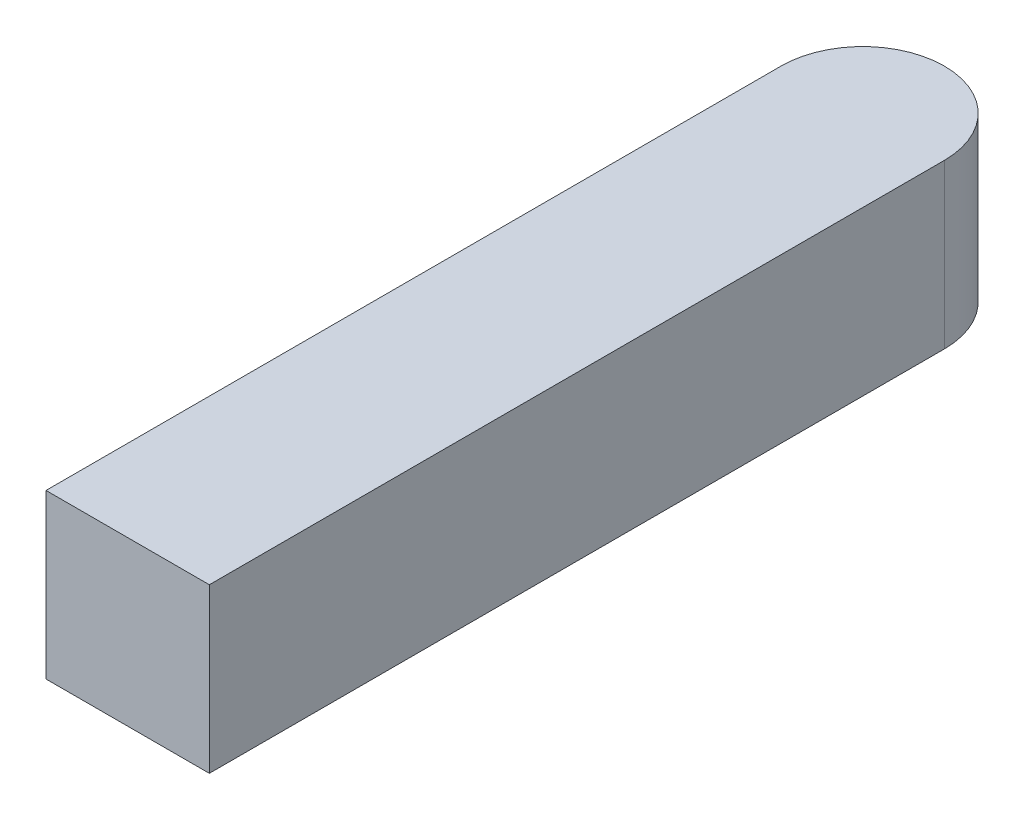
ISO-10303-21;
HEADER;
FILE_DESCRIPTION(('STEP AP214'),'2;1');
FILE_NAME('part.step','',(''),(''),'','','');
FILE_SCHEMA(('AUTOMOTIVE_DESIGN { 1 0 10303 214 1 1 1 1 }'));
ENDSEC;
DATA;
#1=APPLICATION_CONTEXT('core data for automotive mechanical design processes');
#2=APPLICATION_PROTOCOL_DEFINITION('international standard','automotive_design',2000,#1);
#3=PRODUCT_CONTEXT('',#1,'mechanical');
#4=PRODUCT('Part','Part','',(#3));
#5=PRODUCT_RELATED_PRODUCT_CATEGORY('part','',(#4));
#6=PRODUCT_DEFINITION_FORMATION('','',#4);
#7=PRODUCT_DEFINITION_CONTEXT('part definition',#1,'design');
#8=PRODUCT_DEFINITION('design','',#6,#7);
#9=PRODUCT_DEFINITION_SHAPE('','',#8);
#10=(LENGTH_UNIT() NAMED_UNIT(*) SI_UNIT(.MILLI.,.METRE.));
#11=(NAMED_UNIT(*) PLANE_ANGLE_UNIT() SI_UNIT($,.RADIAN.));
#12=(NAMED_UNIT(*) SI_UNIT($,.STERADIAN.) SOLID_ANGLE_UNIT());
#13=UNCERTAINTY_MEASURE_WITH_UNIT(LENGTH_MEASURE(1.E-05),#10,'distance_accuracy_value','');
#14=(GEOMETRIC_REPRESENTATION_CONTEXT(3) GLOBAL_UNCERTAINTY_ASSIGNED_CONTEXT((#13)) GLOBAL_UNIT_ASSIGNED_CONTEXT((#10,
#11,#12)) REPRESENTATION_CONTEXT('',''));
#15=CARTESIAN_POINT('',(0.,0.,0.));
#16=DIRECTION('',(0.,0.,1.));
#17=DIRECTION('',(1.,0.,0.));
#18=AXIS2_PLACEMENT_3D('',#15,#16,#17);
#19=CARTESIAN_POINT('',(1.5,1.5,-6.75));
#20=DIRECTION('',(-1.,0.,0.));
#21=DIRECTION('',(0.,0.,1.));
#22=AXIS2_PLACEMENT_3D('',#19,#20,#21);
#23=PLANE('',#22);
#24=DIRECTION('',(0.,0.,-1.));
#25=VECTOR('',#24,1.);
#26=CARTESIAN_POINT('',(1.5,-1.5,-6.75));
#27=LINE('',#26,#25);
#28=CARTESIAN_POINT('',(1.5,-1.5,6.75));
#29=VERTEX_POINT('',#28);
#30=CARTESIAN_POINT('',(1.5,-1.5,-6.75));
#31=VERTEX_POINT('',#30);
#32=EDGE_CURVE('E96',#29,#31,#27,.T.);
#33=ORIENTED_EDGE('',*,*,#32,.T.);
#34=DIRECTION('',(0.,-1.,0.));
#35=VECTOR('',#34,1.);
#36=CARTESIAN_POINT('',(1.5,1.5,-6.75));
#37=LINE('',#36,#35);
#38=CARTESIAN_POINT('',(1.5,1.5,-6.75));
#39=VERTEX_POINT('',#38);
#40=EDGE_CURVE('E11',#39,#31,#37,.T.);
#41=ORIENTED_EDGE('',*,*,#40,.F.);
#42=DIRECTION('',(0.,0.,-1.));
#43=VECTOR('',#42,1.);
#44=CARTESIAN_POINT('',(1.5,1.5,-6.75));
#45=LINE('',#44,#43);
#46=CARTESIAN_POINT('',(1.5,1.5,6.75));
#47=VERTEX_POINT('',#46);
#48=EDGE_CURVE('E84',#47,#39,#45,.T.);
#49=ORIENTED_EDGE('',*,*,#48,.F.);
#50=DIRECTION('',(0.,-1.,0.));
#51=VECTOR('',#50,1.);
#52=CARTESIAN_POINT('',(1.5,1.5,6.75));
#53=LINE('',#52,#51);
#54=EDGE_CURVE('E92',#47,#29,#53,.T.);
#55=ORIENTED_EDGE('',*,*,#54,.T.);
#56=EDGE_LOOP('',(#33,#41,#49,#55));
#57=FACE_BOUND('',#56,.T.);
#58=ADVANCED_FACE('F33',(#57),#23,.F.);
#59=CARTESIAN_POINT('',(0.,1.5,-6.75));
#60=DIRECTION('',(0.,-1.,0.));
#61=DIRECTION('',(0.,0.,-1.));
#62=AXIS2_PLACEMENT_3D('',#59,#60,#61);
#63=CYLINDRICAL_SURFACE('',#62,1.5);
#64=CARTESIAN_POINT('',(0.,-1.5,-6.75));
#65=DIRECTION('',(0.,1.,0.));
#66=DIRECTION('',(0.,0.,-1.));
#67=AXIS2_PLACEMENT_3D('',#64,#65,#66);
#68=CIRCLE('',#67,1.5);
#69=CARTESIAN_POINT('',(-1.5,-1.5,-6.75));
#70=VERTEX_POINT('',#69);
#71=EDGE_CURVE('E88',#31,#70,#68,.T.);
#72=ORIENTED_EDGE('',*,*,#71,.T.);
#73=DIRECTION('',(0.,-1.,0.));
#74=VECTOR('',#73,1.);
#75=CARTESIAN_POINT('',(-1.5,1.5,-6.75));
#76=LINE('',#75,#74);
#77=CARTESIAN_POINT('',(-1.5,1.5,-6.75));
#78=VERTEX_POINT('',#77);
#79=EDGE_CURVE('E41',#78,#70,#76,.T.);
#80=ORIENTED_EDGE('',*,*,#79,.F.);
#81=CARTESIAN_POINT('',(0.,1.5,-6.75));
#82=DIRECTION('',(0.,1.,0.));
#83=DIRECTION('',(0.,0.,-1.));
#84=AXIS2_PLACEMENT_3D('',#81,#82,#83);
#85=CIRCLE('',#84,1.5);
#86=EDGE_CURVE('E79',#39,#78,#85,.T.);
#87=ORIENTED_EDGE('',*,*,#86,.F.);
#88=ORIENTED_EDGE('',*,*,#40,.T.);
#89=EDGE_LOOP('',(#72,#80,#87,#88));
#90=FACE_BOUND('',#89,.T.);
#91=ADVANCED_FACE('F87',(#90),#63,.T.);
#92=CARTESIAN_POINT('',(-1.5,1.5,-6.75));
#93=DIRECTION('',(1.,0.,0.));
#94=DIRECTION('',(0.,0.,-1.));
#95=AXIS2_PLACEMENT_3D('',#92,#93,#94);
#96=PLANE('',#95);
#97=DIRECTION('',(0.,0.,1.));
#98=VECTOR('',#97,1.);
#99=CARTESIAN_POINT('',(-1.5,-1.5,-6.75));
#100=LINE('',#99,#98);
#101=CARTESIAN_POINT('',(-1.5,-1.5,6.75));
#102=VERTEX_POINT('',#101);
#103=EDGE_CURVE('E66',#70,#102,#100,.T.);
#104=ORIENTED_EDGE('',*,*,#103,.T.);
#105=DIRECTION('',(0.,-1.,0.));
#106=VECTOR('',#105,1.);
#107=CARTESIAN_POINT('',(-1.5,1.5,6.75));
#108=LINE('',#107,#106);
#109=CARTESIAN_POINT('',(-1.5,1.5,6.75));
#110=VERTEX_POINT('',#109);
#111=EDGE_CURVE('E89',#110,#102,#108,.T.);
#112=ORIENTED_EDGE('',*,*,#111,.F.);
#113=DIRECTION('',(0.,0.,1.));
#114=VECTOR('',#113,1.);
#115=CARTESIAN_POINT('',(-1.5,1.5,-6.75));
#116=LINE('',#115,#114);
#117=EDGE_CURVE('E82',#78,#110,#116,.T.);
#118=ORIENTED_EDGE('',*,*,#117,.F.);
#119=ORIENTED_EDGE('',*,*,#79,.T.);
#120=EDGE_LOOP('',(#104,#112,#118,#119));
#121=FACE_BOUND('',#120,.T.);
#122=ADVANCED_FACE('F90',(#121),#96,.F.);
#123=CARTESIAN_POINT('',(-1.5,1.5,6.75));
#124=DIRECTION('',(0.,0.,-1.));
#125=DIRECTION('',(-1.,0.,0.));
#126=AXIS2_PLACEMENT_3D('',#123,#124,#125);
#127=PLANE('',#126);
#128=DIRECTION('',(1.,0.,0.));
#129=VECTOR('',#128,1.);
#130=CARTESIAN_POINT('',(-1.5,-1.5,6.75));
#131=LINE('',#130,#129);
#132=EDGE_CURVE('E72',#102,#29,#131,.T.);
#133=ORIENTED_EDGE('',*,*,#132,.T.);
#134=ORIENTED_EDGE('',*,*,#54,.F.);
#135=DIRECTION('',(1.,0.,0.));
#136=VECTOR('',#135,1.);
#137=CARTESIAN_POINT('',(-1.5,1.5,6.75));
#138=LINE('',#137,#136);
#139=EDGE_CURVE('E49',#110,#47,#138,.T.);
#140=ORIENTED_EDGE('',*,*,#139,.F.);
#141=ORIENTED_EDGE('',*,*,#111,.T.);
#142=EDGE_LOOP('',(#133,#134,#140,#141));
#143=FACE_BOUND('',#142,.T.);
#144=ADVANCED_FACE('F103',(#143),#127,.F.);
#145=CARTESIAN_POINT('',(0.,1.5,-6.75));
#146=DIRECTION('',(0.,-1.,0.));
#147=DIRECTION('',(0.,0.,-1.));
#148=AXIS2_PLACEMENT_3D('',#145,#146,#147);
#149=PLANE('',#148);
#150=ORIENTED_EDGE('',*,*,#48,.T.);
#151=ORIENTED_EDGE('',*,*,#86,.T.);
#152=ORIENTED_EDGE('',*,*,#117,.T.);
#153=ORIENTED_EDGE('',*,*,#139,.T.);
#154=EDGE_LOOP('',(#150,#151,#152,#153));
#155=FACE_BOUND('',#154,.T.);
#156=ADVANCED_FACE('F80',(#155),#149,.F.);
#157=CARTESIAN_POINT('',(0.,-1.5,-6.75));
#158=DIRECTION('',(0.,-1.,0.));
#159=DIRECTION('',(0.,0.,-1.));
#160=AXIS2_PLACEMENT_3D('',#157,#158,#159);
#161=PLANE('',#160);
#162=ORIENTED_EDGE('',*,*,#32,.F.);
#163=ORIENTED_EDGE('',*,*,#132,.F.);
#164=ORIENTED_EDGE('',*,*,#103,.F.);
#165=ORIENTED_EDGE('',*,*,#71,.F.);
#166=EDGE_LOOP('',(#162,#163,#164,#165));
#167=FACE_BOUND('',#166,.T.);
#168=ADVANCED_FACE('F106',(#167),#161,.T.);
#169=CLOSED_SHELL('',(#58,#91,#122,#144,#156,#168));
#170=MANIFOLD_SOLID_BREP('B2',#169);
#171=ADVANCED_BREP_SHAPE_REPRESENTATION('',(#18,#170),#14);
#172=SHAPE_DEFINITION_REPRESENTATION(#9,#171);
ENDSEC;
END-ISO-10303-21;
